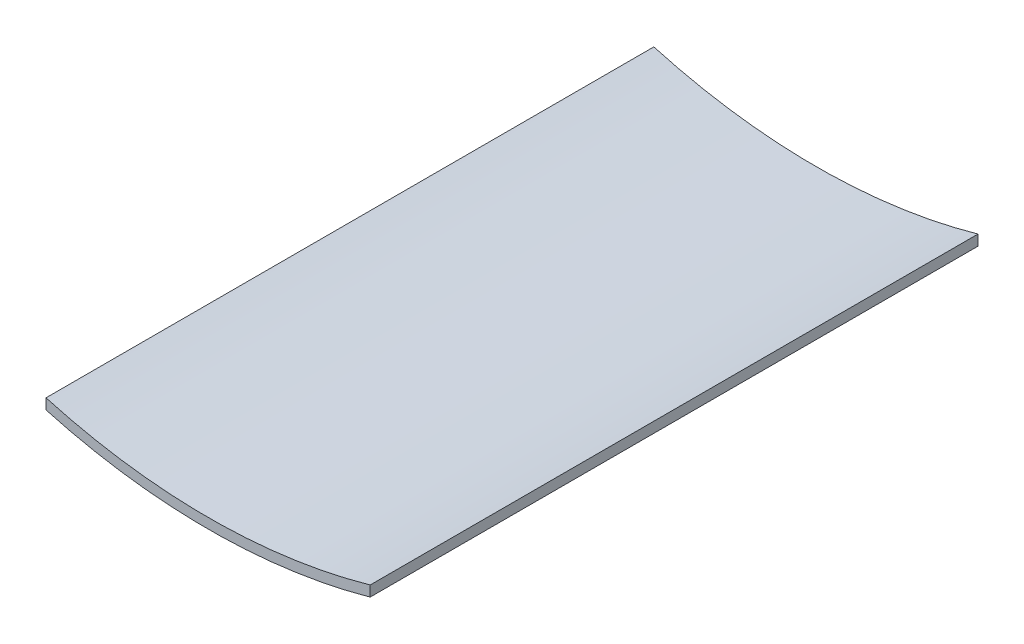
ISO-10303-21;
HEADER;
FILE_DESCRIPTION(('STEP AP214'),'2;1');
FILE_NAME('part.step','',(''),(''),'','','');
FILE_SCHEMA(('AUTOMOTIVE_DESIGN { 1 0 10303 214 1 1 1 1 }'));
ENDSEC;
DATA;
#1=APPLICATION_CONTEXT('core data for automotive mechanical design processes');
#2=APPLICATION_PROTOCOL_DEFINITION('international standard','automotive_design',2000,#1);
#3=PRODUCT_CONTEXT('',#1,'mechanical');
#4=PRODUCT('Part','Part','',(#3));
#5=PRODUCT_RELATED_PRODUCT_CATEGORY('part','',(#4));
#6=PRODUCT_DEFINITION_FORMATION('','',#4);
#7=PRODUCT_DEFINITION_CONTEXT('part definition',#1,'design');
#8=PRODUCT_DEFINITION('design','',#6,#7);
#9=PRODUCT_DEFINITION_SHAPE('','',#8);
#10=(LENGTH_UNIT() NAMED_UNIT(*) SI_UNIT(.MILLI.,.METRE.));
#11=(NAMED_UNIT(*) PLANE_ANGLE_UNIT() SI_UNIT($,.RADIAN.));
#12=(NAMED_UNIT(*) SI_UNIT($,.STERADIAN.) SOLID_ANGLE_UNIT());
#13=UNCERTAINTY_MEASURE_WITH_UNIT(LENGTH_MEASURE(1.E-05),#10,'distance_accuracy_value','');
#14=(GEOMETRIC_REPRESENTATION_CONTEXT(3) GLOBAL_UNCERTAINTY_ASSIGNED_CONTEXT((#13)) GLOBAL_UNIT_ASSIGNED_CONTEXT((#10,
#11,#12)) REPRESENTATION_CONTEXT('',''));
#15=CARTESIAN_POINT('',(0.,0.,0.));
#16=DIRECTION('',(0.,0.,1.));
#17=DIRECTION('',(1.,0.,0.));
#18=AXIS2_PLACEMENT_3D('',#15,#16,#17);
#19=CARTESIAN_POINT('',(0.,3.33066907387547E-13,190.5));
#20=DIRECTION('',(0.,0.,-1.));
#21=DIRECTION('',(-1.,0.,0.));
#22=AXIS2_PLACEMENT_3D('',#19,#20,#21);
#23=CYLINDRICAL_SURFACE('',#22,189.23);
#24=CARTESIAN_POINT('',(0.,3.33066907387547E-13,0.));
#25=DIRECTION('',(0.,0.,1.));
#26=DIRECTION('',(1.,0.,0.));
#27=AXIS2_PLACEMENT_3D('',#24,#25,#26);
#28=CIRCLE('',#27,189.23);
#29=CARTESIAN_POINT('',(-50.7999999999999,-182.283715399923,0.));
#30=VERTEX_POINT('',#29);
#31=CARTESIAN_POINT('',(50.8,-182.283715399923,0.));
#32=VERTEX_POINT('',#31);
#33=EDGE_CURVE('E115',#30,#32,#28,.T.);
#34=ORIENTED_EDGE('',*,*,#33,.T.);
#35=DIRECTION('',(0.,0.,-1.));
#36=VECTOR('',#35,1.);
#37=CARTESIAN_POINT('',(50.8,-182.283715399923,190.5));
#38=LINE('',#37,#36);
#39=CARTESIAN_POINT('',(50.8,-182.283715399923,190.5));
#40=VERTEX_POINT('',#39);
#41=EDGE_CURVE('E11',#40,#32,#38,.T.);
#42=ORIENTED_EDGE('',*,*,#41,.F.);
#43=CARTESIAN_POINT('',(0.,3.33066907387547E-13,190.5));
#44=DIRECTION('',(0.,0.,1.));
#45=DIRECTION('',(1.,0.,0.));
#46=AXIS2_PLACEMENT_3D('',#43,#44,#45);
#47=CIRCLE('',#46,189.23);
#48=CARTESIAN_POINT('',(-50.7999999999999,-182.283715399923,190.5));
#49=VERTEX_POINT('',#48);
#50=EDGE_CURVE('E99',#49,#40,#47,.T.);
#51=ORIENTED_EDGE('',*,*,#50,.F.);
#52=DIRECTION('',(0.,0.,-1.));
#53=VECTOR('',#52,1.);
#54=CARTESIAN_POINT('',(-50.7999999999999,-182.283715399923,190.5));
#55=LINE('',#54,#53);
#56=EDGE_CURVE('E111',#49,#30,#55,.T.);
#57=ORIENTED_EDGE('',*,*,#56,.T.);
#58=EDGE_LOOP('',(#34,#42,#51,#57));
#59=FACE_BOUND('',#58,.T.);
#60=ADVANCED_FACE('F47',(#59),#23,.T.);
#61=CARTESIAN_POINT('',(50.8,-182.283715399923,190.5));
#62=DIRECTION('',(-1.,0.,0.));
#63=DIRECTION('',(0.,-1.,0.));
#64=AXIS2_PLACEMENT_3D('',#61,#62,#63);
#65=PLANE('',#64);
#66=DIRECTION('',(0.,1.,0.));
#67=VECTOR('',#66,1.);
#68=CARTESIAN_POINT('',(50.8,-182.283715399923,0.));
#69=LINE('',#68,#67);
#70=CARTESIAN_POINT('',(50.8,-178.985538591809,0.));
#71=VERTEX_POINT('',#70);
#72=EDGE_CURVE('E104',#32,#71,#69,.T.);
#73=ORIENTED_EDGE('',*,*,#72,.T.);
#74=DIRECTION('',(0.,0.,-1.));
#75=VECTOR('',#74,1.);
#76=CARTESIAN_POINT('',(50.8,-178.985538591809,190.5));
#77=LINE('',#76,#75);
#78=CARTESIAN_POINT('',(50.8,-178.985538591809,190.5));
#79=VERTEX_POINT('',#78);
#80=EDGE_CURVE('E56',#79,#71,#77,.T.);
#81=ORIENTED_EDGE('',*,*,#80,.F.);
#82=DIRECTION('',(0.,1.,0.));
#83=VECTOR('',#82,1.);
#84=CARTESIAN_POINT('',(50.8,-182.283715399923,190.5));
#85=LINE('',#84,#83);
#86=EDGE_CURVE('E94',#40,#79,#85,.T.);
#87=ORIENTED_EDGE('',*,*,#86,.F.);
#88=ORIENTED_EDGE('',*,*,#41,.T.);
#89=EDGE_LOOP('',(#73,#81,#87,#88));
#90=FACE_BOUND('',#89,.T.);
#91=ADVANCED_FACE('F103',(#90),#65,.F.);
#92=CARTESIAN_POINT('',(4.33680868994202E-13,2.02615701994091E-12,190.5));
#93=DIRECTION('',(0.,0.,-1.));
#94=DIRECTION('',(-1.,0.,0.));
#95=AXIS2_PLACEMENT_3D('',#92,#93,#94);
#96=CYLINDRICAL_SURFACE('',#95,186.055000000002);
#97=CARTESIAN_POINT('',(4.33680868994202E-13,2.02615701994091E-12,0.));
#98=DIRECTION('',(0.,0.,-1.));
#99=DIRECTION('',(1.,0.,0.));
#100=AXIS2_PLACEMENT_3D('',#97,#98,#99);
#101=CIRCLE('',#100,186.055000000002);
#102=CARTESIAN_POINT('',(-50.7999999999999,-178.985538591809,0.));
#103=VERTEX_POINT('',#102);
#104=EDGE_CURVE('E81',#71,#103,#101,.T.);
#105=ORIENTED_EDGE('',*,*,#104,.T.);
#106=DIRECTION('',(0.,0.,-1.));
#107=VECTOR('',#106,1.);
#108=CARTESIAN_POINT('',(-50.7999999999999,-178.985538591809,190.5));
#109=LINE('',#108,#107);
#110=CARTESIAN_POINT('',(-50.7999999999999,-178.985538591809,190.5));
#111=VERTEX_POINT('',#110);
#112=EDGE_CURVE('E106',#111,#103,#109,.T.);
#113=ORIENTED_EDGE('',*,*,#112,.F.);
#114=CARTESIAN_POINT('',(4.33680868994202E-13,2.02615701994091E-12,190.5));
#115=DIRECTION('',(0.,0.,-1.));
#116=DIRECTION('',(1.,0.,0.));
#117=AXIS2_PLACEMENT_3D('',#114,#115,#116);
#118=CIRCLE('',#117,186.055000000002);
#119=EDGE_CURVE('E97',#79,#111,#118,.T.);
#120=ORIENTED_EDGE('',*,*,#119,.F.);
#121=ORIENTED_EDGE('',*,*,#80,.T.);
#122=EDGE_LOOP('',(#105,#113,#120,#121));
#123=FACE_BOUND('',#122,.T.);
#124=ADVANCED_FACE('F107',(#123),#96,.F.);
#125=CARTESIAN_POINT('',(-50.7999999999999,-182.283715399923,190.5));
#126=DIRECTION('',(1.,0.,0.));
#127=DIRECTION('',(0.,1.,0.));
#128=AXIS2_PLACEMENT_3D('',#125,#126,#127);
#129=PLANE('',#128);
#130=DIRECTION('',(0.,-1.,0.));
#131=VECTOR('',#130,1.);
#132=CARTESIAN_POINT('',(-50.7999999999999,-182.283715399923,0.));
#133=LINE('',#132,#131);
#134=EDGE_CURVE('E87',#103,#30,#133,.T.);
#135=ORIENTED_EDGE('',*,*,#134,.T.);
#136=ORIENTED_EDGE('',*,*,#56,.F.);
#137=DIRECTION('',(0.,-1.,0.));
#138=VECTOR('',#137,1.);
#139=CARTESIAN_POINT('',(-50.7999999999999,-182.283715399923,190.5));
#140=LINE('',#139,#138);
#141=EDGE_CURVE('E64',#111,#49,#140,.T.);
#142=ORIENTED_EDGE('',*,*,#141,.F.);
#143=ORIENTED_EDGE('',*,*,#112,.T.);
#144=EDGE_LOOP('',(#135,#136,#142,#143));
#145=FACE_BOUND('',#144,.T.);
#146=ADVANCED_FACE('F128',(#145),#129,.F.);
#147=CARTESIAN_POINT('',(0.,3.33066907387547E-13,190.5));
#148=DIRECTION('',(0.,0.,1.));
#149=DIRECTION('',(1.,0.,0.));
#150=AXIS2_PLACEMENT_3D('',#147,#148,#149);
#151=PLANE('',#150);
#152=ORIENTED_EDGE('',*,*,#50,.T.);
#153=ORIENTED_EDGE('',*,*,#86,.T.);
#154=ORIENTED_EDGE('',*,*,#119,.T.);
#155=ORIENTED_EDGE('',*,*,#141,.T.);
#156=EDGE_LOOP('',(#152,#153,#154,#155));
#157=FACE_BOUND('',#156,.T.);
#158=ADVANCED_FACE('F95',(#157),#151,.T.);
#159=CARTESIAN_POINT('',(0.,3.33066907387547E-13,0.));
#160=DIRECTION('',(0.,0.,1.));
#161=DIRECTION('',(1.,0.,0.));
#162=AXIS2_PLACEMENT_3D('',#159,#160,#161);
#163=PLANE('',#162);
#164=ORIENTED_EDGE('',*,*,#33,.F.);
#165=ORIENTED_EDGE('',*,*,#134,.F.);
#166=ORIENTED_EDGE('',*,*,#104,.F.);
#167=ORIENTED_EDGE('',*,*,#72,.F.);
#168=EDGE_LOOP('',(#164,#165,#166,#167));
#169=FACE_BOUND('',#168,.T.);
#170=ADVANCED_FACE('F131',(#169),#163,.F.);
#171=CLOSED_SHELL('',(#60,#91,#124,#146,#158,#170));
#172=MANIFOLD_SOLID_BREP('B2',#171);
#173=ADVANCED_BREP_SHAPE_REPRESENTATION('',(#18,#172),#14);
#174=SHAPE_DEFINITION_REPRESENTATION(#9,#173);
ENDSEC;
END-ISO-10303-21;
